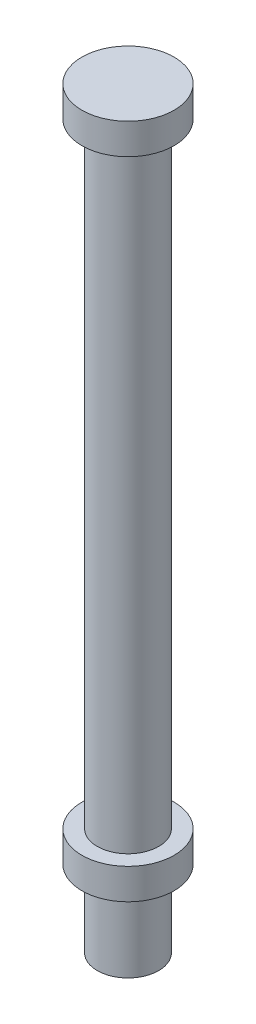
ISO-10303-21;
HEADER;
FILE_DESCRIPTION(('STEP AP214'),'2;1');
FILE_NAME('part.step','',(''),(''),'','','');
FILE_SCHEMA(('AUTOMOTIVE_DESIGN { 1 0 10303 214 1 1 1 1 }'));
ENDSEC;
DATA;
#1=APPLICATION_CONTEXT('core data for automotive mechanical design processes');
#2=APPLICATION_PROTOCOL_DEFINITION('international standard','automotive_design',2000,#1);
#3=PRODUCT_CONTEXT('',#1,'mechanical');
#4=PRODUCT('Part','Part','',(#3));
#5=PRODUCT_RELATED_PRODUCT_CATEGORY('part','',(#4));
#6=PRODUCT_DEFINITION_FORMATION('','',#4);
#7=PRODUCT_DEFINITION_CONTEXT('part definition',#1,'design');
#8=PRODUCT_DEFINITION('design','',#6,#7);
#9=PRODUCT_DEFINITION_SHAPE('','',#8);
#10=(LENGTH_UNIT() NAMED_UNIT(*) SI_UNIT(.MILLI.,.METRE.));
#11=(NAMED_UNIT(*) PLANE_ANGLE_UNIT() SI_UNIT($,.RADIAN.));
#12=(NAMED_UNIT(*) SI_UNIT($,.STERADIAN.) SOLID_ANGLE_UNIT());
#13=UNCERTAINTY_MEASURE_WITH_UNIT(LENGTH_MEASURE(1.E-05),#10,'distance_accuracy_value','');
#14=(GEOMETRIC_REPRESENTATION_CONTEXT(3) GLOBAL_UNCERTAINTY_ASSIGNED_CONTEXT((#13)) GLOBAL_UNIT_ASSIGNED_CONTEXT((#10,
#11,#12)) REPRESENTATION_CONTEXT('',''));
#15=CARTESIAN_POINT('',(0.,0.,0.));
#16=DIRECTION('',(0.,0.,1.));
#17=DIRECTION('',(1.,0.,0.));
#18=AXIS2_PLACEMENT_3D('',#15,#16,#17);
#19=CARTESIAN_POINT('',(0.,400.,0.));
#20=DIRECTION('',(0.,-1.,0.));
#21=DIRECTION('',(0.,0.,-1.));
#22=AXIS2_PLACEMENT_3D('',#19,#20,#21);
#23=CYLINDRICAL_SURFACE('',#22,20.);
#24=CARTESIAN_POINT('',(0.,400.,0.));
#25=DIRECTION('',(0.,1.,0.));
#26=DIRECTION('',(0.,0.,1.));
#27=AXIS2_PLACEMENT_3D('',#24,#25,#26);
#28=CIRCLE('',#27,20.);
#29=CARTESIAN_POINT('',(0.,400.,20.));
#30=VERTEX_POINT('',#29);
#31=EDGE_CURVE('E37',#30,#30,#28,.T.);
#32=ORIENTED_EDGE('',*,*,#31,.F.);
#33=EDGE_LOOP('',(#32));
#34=FACE_BOUND('',#33,.T.);
#35=CARTESIAN_POINT('',(0.,0.,0.));
#36=DIRECTION('',(0.,1.,0.));
#37=DIRECTION('',(0.,0.,1.));
#38=AXIS2_PLACEMENT_3D('',#35,#36,#37);
#39=CIRCLE('',#38,20.);
#40=CARTESIAN_POINT('',(0.,0.,20.));
#41=VERTEX_POINT('',#40);
#42=EDGE_CURVE('E33',#41,#41,#39,.T.);
#43=ORIENTED_EDGE('',*,*,#42,.T.);
#44=EDGE_LOOP('',(#43));
#45=FACE_BOUND('',#44,.T.);
#46=ADVANCED_FACE('F30',(#34,#45),#23,.T.);
#47=CARTESIAN_POINT('',(0.,420.,0.));
#48=DIRECTION('',(0.,-1.,0.));
#49=DIRECTION('',(0.,0.,-1.));
#50=AXIS2_PLACEMENT_3D('',#47,#48,#49);
#51=CYLINDRICAL_SURFACE('',#50,30.);
#52=CARTESIAN_POINT('',(0.,420.,0.));
#53=DIRECTION('',(0.,1.,0.));
#54=DIRECTION('',(0.,0.,1.));
#55=AXIS2_PLACEMENT_3D('',#52,#53,#54);
#56=CIRCLE('',#55,30.);
#57=CARTESIAN_POINT('',(0.,420.,30.));
#58=VERTEX_POINT('',#57);
#59=EDGE_CURVE('E42',#58,#58,#56,.T.);
#60=ORIENTED_EDGE('',*,*,#59,.F.);
#61=EDGE_LOOP('',(#60));
#62=FACE_BOUND('',#61,.T.);
#63=CARTESIAN_POINT('',(0.,400.,0.));
#64=DIRECTION('',(0.,1.,0.));
#65=DIRECTION('',(0.,0.,1.));
#66=AXIS2_PLACEMENT_3D('',#63,#64,#65);
#67=CIRCLE('',#66,30.);
#68=CARTESIAN_POINT('',(0.,400.,30.));
#69=VERTEX_POINT('',#68);
#70=EDGE_CURVE('E54',#69,#69,#67,.T.);
#71=ORIENTED_EDGE('',*,*,#70,.T.);
#72=EDGE_LOOP('',(#71));
#73=FACE_BOUND('',#72,.T.);
#74=ADVANCED_FACE('F87',(#62,#73),#51,.T.);
#75=CARTESIAN_POINT('',(0.,420.,0.));
#76=DIRECTION('',(0.,1.,0.));
#77=DIRECTION('',(0.,0.,1.));
#78=AXIS2_PLACEMENT_3D('',#75,#76,#77);
#79=PLANE('',#78);
#80=ORIENTED_EDGE('',*,*,#59,.T.);
#81=EDGE_LOOP('',(#80));
#82=FACE_BOUND('',#81,.T.);
#83=ADVANCED_FACE('F81',(#82),#79,.T.);
#84=CARTESIAN_POINT('',(0.,400.,0.));
#85=DIRECTION('',(0.,1.,0.));
#86=DIRECTION('',(0.,0.,1.));
#87=AXIS2_PLACEMENT_3D('',#84,#85,#86);
#88=PLANE('',#87);
#89=ORIENTED_EDGE('',*,*,#31,.T.);
#90=EDGE_LOOP('',(#89));
#91=FACE_BOUND('',#90,.T.);
#92=ORIENTED_EDGE('',*,*,#70,.F.);
#93=EDGE_LOOP('',(#92));
#94=FACE_BOUND('',#93,.T.);
#95=ADVANCED_FACE('F72',(#91,#94),#88,.F.);
#96=CARTESIAN_POINT('',(0.,-20.,0.));
#97=DIRECTION('',(0.,1.,0.));
#98=DIRECTION('',(0.,0.,1.));
#99=AXIS2_PLACEMENT_3D('',#96,#97,#98);
#100=CYLINDRICAL_SURFACE('',#99,30.);
#101=CARTESIAN_POINT('',(0.,-20.,0.));
#102=DIRECTION('',(0.,-1.,0.));
#103=DIRECTION('',(0.,0.,-1.));
#104=AXIS2_PLACEMENT_3D('',#101,#102,#103);
#105=CIRCLE('',#104,30.);
#106=CARTESIAN_POINT('',(0.,-20.,-30.));
#107=VERTEX_POINT('',#106);
#108=EDGE_CURVE('E46',#107,#107,#105,.T.);
#109=ORIENTED_EDGE('',*,*,#108,.F.);
#110=EDGE_LOOP('',(#109));
#111=FACE_BOUND('',#110,.T.);
#112=CARTESIAN_POINT('',(0.,0.,0.));
#113=DIRECTION('',(0.,-1.,0.));
#114=DIRECTION('',(0.,0.,-1.));
#115=AXIS2_PLACEMENT_3D('',#112,#113,#114);
#116=CIRCLE('',#115,30.);
#117=CARTESIAN_POINT('',(0.,0.,-30.));
#118=VERTEX_POINT('',#117);
#119=EDGE_CURVE('E49',#118,#118,#116,.T.);
#120=ORIENTED_EDGE('',*,*,#119,.T.);
#121=EDGE_LOOP('',(#120));
#122=FACE_BOUND('',#121,.T.);
#123=ADVANCED_FACE('F70',(#111,#122),#100,.T.);
#124=CARTESIAN_POINT('',(0.,-20.,0.));
#125=DIRECTION('',(0.,-1.,0.));
#126=DIRECTION('',(0.,0.,-1.));
#127=AXIS2_PLACEMENT_3D('',#124,#125,#126);
#128=PLANE('',#127);
#129=CARTESIAN_POINT('',(0.,-20.,0.));
#130=DIRECTION('',(0.,-1.,0.));
#131=DIRECTION('',(0.,0.,-1.));
#132=AXIS2_PLACEMENT_3D('',#129,#130,#131);
#133=CIRCLE('',#132,20.);
#134=CARTESIAN_POINT('',(0.,-20.,-20.));
#135=VERTEX_POINT('',#134);
#136=EDGE_CURVE('E10',#135,#135,#133,.T.);
#137=ORIENTED_EDGE('',*,*,#136,.F.);
#138=EDGE_LOOP('',(#137));
#139=FACE_BOUND('',#138,.T.);
#140=ORIENTED_EDGE('',*,*,#108,.T.);
#141=EDGE_LOOP('',(#140));
#142=FACE_BOUND('',#141,.T.);
#143=ADVANCED_FACE('F66',(#139,#142),#128,.T.);
#144=CARTESIAN_POINT('',(0.,0.,0.));
#145=DIRECTION('',(0.,-1.,0.));
#146=DIRECTION('',(0.,0.,-1.));
#147=AXIS2_PLACEMENT_3D('',#144,#145,#146);
#148=PLANE('',#147);
#149=ORIENTED_EDGE('',*,*,#42,.F.);
#150=EDGE_LOOP('',(#149));
#151=FACE_BOUND('',#150,.T.);
#152=ORIENTED_EDGE('',*,*,#119,.F.);
#153=EDGE_LOOP('',(#152));
#154=FACE_BOUND('',#153,.T.);
#155=ADVANCED_FACE('F62',(#151,#154),#148,.F.);
#156=CARTESIAN_POINT('',(0.,-70.,0.));
#157=DIRECTION('',(0.,1.,0.));
#158=DIRECTION('',(0.,0.,1.));
#159=AXIS2_PLACEMENT_3D('',#156,#157,#158);
#160=CYLINDRICAL_SURFACE('',#159,20.);
#161=CARTESIAN_POINT('',(0.,-70.,0.));
#162=DIRECTION('',(0.,-1.,0.));
#163=DIRECTION('',(0.,0.,-1.));
#164=AXIS2_PLACEMENT_3D('',#161,#162,#163);
#165=CIRCLE('',#164,20.);
#166=CARTESIAN_POINT('',(0.,-70.,-20.));
#167=VERTEX_POINT('',#166);
#168=EDGE_CURVE('E45',#167,#167,#165,.T.);
#169=ORIENTED_EDGE('',*,*,#168,.F.);
#170=EDGE_LOOP('',(#169));
#171=FACE_BOUND('',#170,.T.);
#172=ORIENTED_EDGE('',*,*,#136,.T.);
#173=EDGE_LOOP('',(#172));
#174=FACE_BOUND('',#173,.T.);
#175=ADVANCED_FACE('F65',(#171,#174),#160,.T.);
#176=CARTESIAN_POINT('',(0.,-70.,0.));
#177=DIRECTION('',(0.,-1.,0.));
#178=DIRECTION('',(0.,0.,-1.));
#179=AXIS2_PLACEMENT_3D('',#176,#177,#178);
#180=PLANE('',#179);
#181=ORIENTED_EDGE('',*,*,#168,.T.);
#182=EDGE_LOOP('',(#181));
#183=FACE_BOUND('',#182,.T.);
#184=ADVANCED_FACE('F131',(#183),#180,.T.);
#185=CLOSED_SHELL('',(#46,#74,#83,#95,#123,#143,#155,#175,#184));
#186=MANIFOLD_SOLID_BREP('B2',#185);
#187=ADVANCED_BREP_SHAPE_REPRESENTATION('',(#18,#186),#14);
#188=SHAPE_DEFINITION_REPRESENTATION(#9,#187);
ENDSEC;
END-ISO-10303-21;
